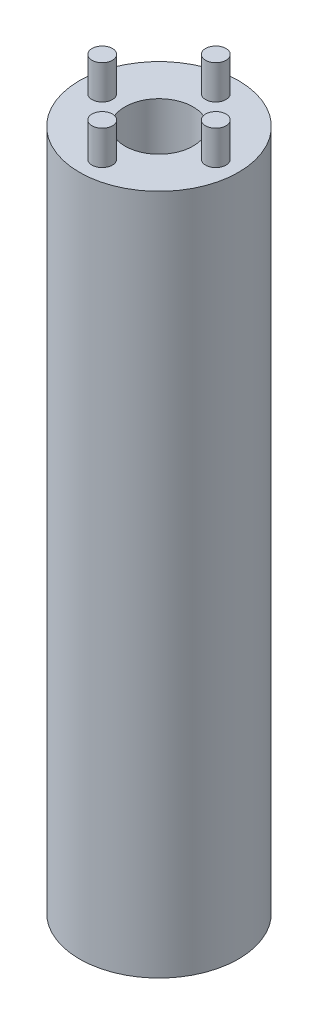
ISO-10303-21;
HEADER;
FILE_DESCRIPTION(('STEP AP214'),'2;1');
FILE_NAME('part.step','',(''),(''),'','','');
FILE_SCHEMA(('AUTOMOTIVE_DESIGN { 1 0 10303 214 1 1 1 1 }'));
ENDSEC;
DATA;
#1=APPLICATION_CONTEXT('core data for automotive mechanical design processes');
#2=APPLICATION_PROTOCOL_DEFINITION('international standard','automotive_design',2000,#1);
#3=PRODUCT_CONTEXT('',#1,'mechanical');
#4=PRODUCT('Part','Part','',(#3));
#5=PRODUCT_RELATED_PRODUCT_CATEGORY('part','',(#4));
#6=PRODUCT_DEFINITION_FORMATION('','',#4);
#7=PRODUCT_DEFINITION_CONTEXT('part definition',#1,'design');
#8=PRODUCT_DEFINITION('design','',#6,#7);
#9=PRODUCT_DEFINITION_SHAPE('','',#8);
#10=(LENGTH_UNIT() NAMED_UNIT(*) SI_UNIT(.MILLI.,.METRE.));
#11=(NAMED_UNIT(*) PLANE_ANGLE_UNIT() SI_UNIT($,.RADIAN.));
#12=(NAMED_UNIT(*) SI_UNIT($,.STERADIAN.) SOLID_ANGLE_UNIT());
#13=UNCERTAINTY_MEASURE_WITH_UNIT(LENGTH_MEASURE(1.E-05),#10,'distance_accuracy_value','');
#14=(GEOMETRIC_REPRESENTATION_CONTEXT(3) GLOBAL_UNCERTAINTY_ASSIGNED_CONTEXT((#13)) GLOBAL_UNIT_ASSIGNED_CONTEXT((#10,
#11,#12)) REPRESENTATION_CONTEXT('',''));
#15=CARTESIAN_POINT('',(0.,0.,0.));
#16=DIRECTION('',(0.,0.,1.));
#17=DIRECTION('',(1.,0.,0.));
#18=AXIS2_PLACEMENT_3D('',#15,#16,#17);
#19=CARTESIAN_POINT('',(0.,30.,0.));
#20=DIRECTION('',(0.,-1.,0.));
#21=DIRECTION('',(0.,0.,-1.));
#22=AXIS2_PLACEMENT_3D('',#19,#20,#21);
#23=CYLINDRICAL_SURFACE('',#22,3.5);
#24=CARTESIAN_POINT('',(0.,30.,0.));
#25=DIRECTION('',(0.,1.,0.));
#26=DIRECTION('',(0.,0.,1.));
#27=AXIS2_PLACEMENT_3D('',#24,#25,#26);
#28=CIRCLE('',#27,3.5);
#29=CARTESIAN_POINT('',(0.,30.,3.5));
#30=VERTEX_POINT('',#29);
#31=EDGE_CURVE('E50',#30,#30,#28,.T.);
#32=ORIENTED_EDGE('',*,*,#31,.F.);
#33=EDGE_LOOP('',(#32));
#34=FACE_BOUND('',#33,.T.);
#35=CARTESIAN_POINT('',(0.,0.,0.));
#36=DIRECTION('',(0.,1.,0.));
#37=DIRECTION('',(0.,0.,1.));
#38=AXIS2_PLACEMENT_3D('',#35,#36,#37);
#39=CIRCLE('',#38,3.5);
#40=CARTESIAN_POINT('',(0.,0.,3.5));
#41=VERTEX_POINT('',#40);
#42=EDGE_CURVE('E57',#41,#41,#39,.T.);
#43=ORIENTED_EDGE('',*,*,#42,.T.);
#44=EDGE_LOOP('',(#43));
#45=FACE_BOUND('',#44,.T.);
#46=ADVANCED_FACE('F43',(#34,#45),#23,.T.);
#47=CARTESIAN_POINT('',(0.,30.,0.));
#48=DIRECTION('',(0.,-1.,0.));
#49=DIRECTION('',(0.,0.,-1.));
#50=AXIS2_PLACEMENT_3D('',#47,#48,#49);
#51=CYLINDRICAL_SURFACE('',#50,1.5);
#52=CARTESIAN_POINT('',(0.,30.,0.));
#53=DIRECTION('',(0.,1.,0.));
#54=DIRECTION('',(0.,0.,1.));
#55=AXIS2_PLACEMENT_3D('',#52,#53,#54);
#56=CIRCLE('',#55,1.5);
#57=CARTESIAN_POINT('',(0.,30.,1.5));
#58=VERTEX_POINT('',#57);
#59=EDGE_CURVE('E10',#58,#58,#56,.T.);
#60=ORIENTED_EDGE('',*,*,#59,.T.);
#61=EDGE_LOOP('',(#60));
#62=FACE_BOUND('',#61,.T.);
#63=CARTESIAN_POINT('',(0.,0.,0.));
#64=DIRECTION('',(0.,1.,0.));
#65=DIRECTION('',(0.,0.,1.));
#66=AXIS2_PLACEMENT_3D('',#63,#64,#65);
#67=CIRCLE('',#66,1.5);
#68=CARTESIAN_POINT('',(0.,0.,1.5));
#69=VERTEX_POINT('',#68);
#70=EDGE_CURVE('E46',#69,#69,#67,.T.);
#71=ORIENTED_EDGE('',*,*,#70,.F.);
#72=EDGE_LOOP('',(#71));
#73=FACE_BOUND('',#72,.T.);
#74=ADVANCED_FACE('F95',(#62,#73),#51,.F.);
#75=CARTESIAN_POINT('',(0.,30.,0.));
#76=DIRECTION('',(0.,1.,0.));
#77=DIRECTION('',(0.,0.,1.));
#78=AXIS2_PLACEMENT_3D('',#75,#76,#77);
#79=PLANE('',#78);
#80=CARTESIAN_POINT('',(-2.5,30.,0.));
#81=DIRECTION('',(0.,1.,0.));
#82=DIRECTION('',(0.,0.,1.));
#83=AXIS2_PLACEMENT_3D('',#80,#81,#82);
#84=CIRCLE('',#83,0.45);
#85=CARTESIAN_POINT('',(-2.5,30.,0.449999999999974));
#86=VERTEX_POINT('',#85);
#87=EDGE_CURVE('E64',#86,#86,#84,.T.);
#88=ORIENTED_EDGE('',*,*,#87,.F.);
#89=EDGE_LOOP('',(#88));
#90=FACE_BOUND('',#89,.T.);
#91=CARTESIAN_POINT('',(0.,30.,-2.5));
#92=DIRECTION('',(0.,1.,0.));
#93=DIRECTION('',(0.,0.,1.));
#94=AXIS2_PLACEMENT_3D('',#91,#92,#93);
#95=CIRCLE('',#94,0.45);
#96=CARTESIAN_POINT('',(0.,30.,-2.05));
#97=VERTEX_POINT('',#96);
#98=EDGE_CURVE('E74',#97,#97,#95,.T.);
#99=ORIENTED_EDGE('',*,*,#98,.F.);
#100=EDGE_LOOP('',(#99));
#101=FACE_BOUND('',#100,.T.);
#102=CARTESIAN_POINT('',(2.5,30.,0.));
#103=DIRECTION('',(0.,1.,0.));
#104=DIRECTION('',(0.,0.,1.));
#105=AXIS2_PLACEMENT_3D('',#102,#103,#104);
#106=CIRCLE('',#105,0.45);
#107=CARTESIAN_POINT('',(2.5,30.,0.450000000000009));
#108=VERTEX_POINT('',#107);
#109=EDGE_CURVE('E80',#108,#108,#106,.T.);
#110=ORIENTED_EDGE('',*,*,#109,.F.);
#111=EDGE_LOOP('',(#110));
#112=FACE_BOUND('',#111,.T.);
#113=CARTESIAN_POINT('',(0.,30.,2.5));
#114=DIRECTION('',(0.,1.,0.));
#115=DIRECTION('',(0.,0.,1.));
#116=AXIS2_PLACEMENT_3D('',#113,#114,#115);
#117=CIRCLE('',#116,0.45);
#118=CARTESIAN_POINT('',(0.,30.,2.95));
#119=VERTEX_POINT('',#118);
#120=EDGE_CURVE('E85',#119,#119,#117,.T.);
#121=ORIENTED_EDGE('',*,*,#120,.F.);
#122=EDGE_LOOP('',(#121));
#123=FACE_BOUND('',#122,.T.);
#124=ORIENTED_EDGE('',*,*,#31,.T.);
#125=EDGE_LOOP('',(#124));
#126=FACE_BOUND('',#125,.T.);
#127=ORIENTED_EDGE('',*,*,#59,.F.);
#128=EDGE_LOOP('',(#127));
#129=FACE_BOUND('',#128,.T.);
#130=ADVANCED_FACE('F91',(#90,#101,#112,#123,#126,#129),#79,.T.);
#131=CARTESIAN_POINT('',(0.,0.,0.));
#132=DIRECTION('',(0.,1.,0.));
#133=DIRECTION('',(0.,0.,1.));
#134=AXIS2_PLACEMENT_3D('',#131,#132,#133);
#135=PLANE('',#134);
#136=ORIENTED_EDGE('',*,*,#42,.F.);
#137=EDGE_LOOP('',(#136));
#138=FACE_BOUND('',#137,.T.);
#139=ORIENTED_EDGE('',*,*,#70,.T.);
#140=EDGE_LOOP('',(#139));
#141=FACE_BOUND('',#140,.T.);
#142=ADVANCED_FACE('F94',(#138,#141),#135,.F.);
#143=CARTESIAN_POINT('',(0.,31.5,2.5));
#144=DIRECTION('',(0.,-1.,0.));
#145=DIRECTION('',(0.,0.,-1.));
#146=AXIS2_PLACEMENT_3D('',#143,#144,#145);
#147=CYLINDRICAL_SURFACE('',#146,0.45);
#148=CARTESIAN_POINT('',(0.,31.5,2.5));
#149=DIRECTION('',(0.,1.,0.));
#150=DIRECTION('',(0.,0.,1.));
#151=AXIS2_PLACEMENT_3D('',#148,#149,#150);
#152=CIRCLE('',#151,0.45);
#153=CARTESIAN_POINT('',(0.,31.5,2.95));
#154=VERTEX_POINT('',#153);
#155=EDGE_CURVE('E83',#154,#154,#152,.T.);
#156=ORIENTED_EDGE('',*,*,#155,.F.);
#157=EDGE_LOOP('',(#156));
#158=FACE_BOUND('',#157,.T.);
#159=ORIENTED_EDGE('',*,*,#120,.T.);
#160=EDGE_LOOP('',(#159));
#161=FACE_BOUND('',#160,.T.);
#162=ADVANCED_FACE('F89',(#158,#161),#147,.T.);
#163=CARTESIAN_POINT('',(0.,31.5,0.));
#164=DIRECTION('',(0.,1.,0.));
#165=DIRECTION('',(0.,0.,1.));
#166=AXIS2_PLACEMENT_3D('',#163,#164,#165);
#167=PLANE('',#166);
#168=ORIENTED_EDGE('',*,*,#155,.T.);
#169=EDGE_LOOP('',(#168));
#170=FACE_BOUND('',#169,.T.);
#171=ADVANCED_FACE('F114',(#170),#167,.T.);
#172=CARTESIAN_POINT('',(2.5,31.5,0.));
#173=DIRECTION('',(0.,-1.,0.));
#174=DIRECTION('',(0.,0.,-1.));
#175=AXIS2_PLACEMENT_3D('',#172,#173,#174);
#176=CYLINDRICAL_SURFACE('',#175,0.45);
#177=CARTESIAN_POINT('',(2.5,31.5,0.));
#178=DIRECTION('',(0.,1.,0.));
#179=DIRECTION('',(0.,0.,1.));
#180=AXIS2_PLACEMENT_3D('',#177,#178,#179);
#181=CIRCLE('',#180,0.45);
#182=CARTESIAN_POINT('',(2.5,31.5,0.450000000000009));
#183=VERTEX_POINT('',#182);
#184=EDGE_CURVE('E77',#183,#183,#181,.T.);
#185=ORIENTED_EDGE('',*,*,#184,.F.);
#186=EDGE_LOOP('',(#185));
#187=FACE_BOUND('',#186,.T.);
#188=ORIENTED_EDGE('',*,*,#109,.T.);
#189=EDGE_LOOP('',(#188));
#190=FACE_BOUND('',#189,.T.);
#191=ADVANCED_FACE('F118',(#187,#190),#176,.T.);
#192=CARTESIAN_POINT('',(0.,31.5,0.));
#193=DIRECTION('',(0.,1.,0.));
#194=DIRECTION('',(0.,0.,1.));
#195=AXIS2_PLACEMENT_3D('',#192,#193,#194);
#196=PLANE('',#195);
#197=ORIENTED_EDGE('',*,*,#184,.T.);
#198=EDGE_LOOP('',(#197));
#199=FACE_BOUND('',#198,.T.);
#200=ADVANCED_FACE('F122',(#199),#196,.T.);
#201=CARTESIAN_POINT('',(0.,31.5,-2.5));
#202=DIRECTION('',(0.,-1.,0.));
#203=DIRECTION('',(0.,0.,-1.));
#204=AXIS2_PLACEMENT_3D('',#201,#202,#203);
#205=CYLINDRICAL_SURFACE('',#204,0.45);
#206=CARTESIAN_POINT('',(0.,31.5,-2.5));
#207=DIRECTION('',(0.,1.,0.));
#208=DIRECTION('',(0.,0.,1.));
#209=AXIS2_PLACEMENT_3D('',#206,#207,#208);
#210=CIRCLE('',#209,0.45);
#211=CARTESIAN_POINT('',(0.,31.5,-2.05));
#212=VERTEX_POINT('',#211);
#213=EDGE_CURVE('E69',#212,#212,#210,.T.);
#214=ORIENTED_EDGE('',*,*,#213,.F.);
#215=EDGE_LOOP('',(#214));
#216=FACE_BOUND('',#215,.T.);
#217=ORIENTED_EDGE('',*,*,#98,.T.);
#218=EDGE_LOOP('',(#217));
#219=FACE_BOUND('',#218,.T.);
#220=ADVANCED_FACE('F126',(#216,#219),#205,.T.);
#221=CARTESIAN_POINT('',(0.,31.5,0.));
#222=DIRECTION('',(0.,1.,0.));
#223=DIRECTION('',(0.,0.,1.));
#224=AXIS2_PLACEMENT_3D('',#221,#222,#223);
#225=PLANE('',#224);
#226=ORIENTED_EDGE('',*,*,#213,.T.);
#227=EDGE_LOOP('',(#226));
#228=FACE_BOUND('',#227,.T.);
#229=ADVANCED_FACE('F130',(#228),#225,.T.);
#230=CARTESIAN_POINT('',(-2.5,31.5,0.));
#231=DIRECTION('',(0.,-1.,0.));
#232=DIRECTION('',(0.,0.,-1.));
#233=AXIS2_PLACEMENT_3D('',#230,#231,#232);
#234=CYLINDRICAL_SURFACE('',#233,0.45);
#235=CARTESIAN_POINT('',(-2.5,31.5,0.));
#236=DIRECTION('',(0.,1.,0.));
#237=DIRECTION('',(0.,0.,1.));
#238=AXIS2_PLACEMENT_3D('',#235,#236,#237);
#239=CIRCLE('',#238,0.45);
#240=CARTESIAN_POINT('',(-2.5,31.5,0.449999999999974));
#241=VERTEX_POINT('',#240);
#242=EDGE_CURVE('E59',#241,#241,#239,.T.);
#243=ORIENTED_EDGE('',*,*,#242,.F.);
#244=EDGE_LOOP('',(#243));
#245=FACE_BOUND('',#244,.T.);
#246=ORIENTED_EDGE('',*,*,#87,.T.);
#247=EDGE_LOOP('',(#246));
#248=FACE_BOUND('',#247,.T.);
#249=ADVANCED_FACE('F134',(#245,#248),#234,.T.);
#250=CARTESIAN_POINT('',(0.,31.5,0.));
#251=DIRECTION('',(0.,1.,0.));
#252=DIRECTION('',(0.,0.,1.));
#253=AXIS2_PLACEMENT_3D('',#250,#251,#252);
#254=PLANE('',#253);
#255=ORIENTED_EDGE('',*,*,#242,.T.);
#256=EDGE_LOOP('',(#255));
#257=FACE_BOUND('',#256,.T.);
#258=ADVANCED_FACE('F138',(#257),#254,.T.);
#259=CLOSED_SHELL('',(#46,#74,#130,#142,#162,#171,#191,#200,#220,#229,#249,#258));
#260=MANIFOLD_SOLID_BREP('B2',#259);
#261=ADVANCED_BREP_SHAPE_REPRESENTATION('',(#18,#260),#14);
#262=SHAPE_DEFINITION_REPRESENTATION(#9,#261);
ENDSEC;
END-ISO-10303-21;
